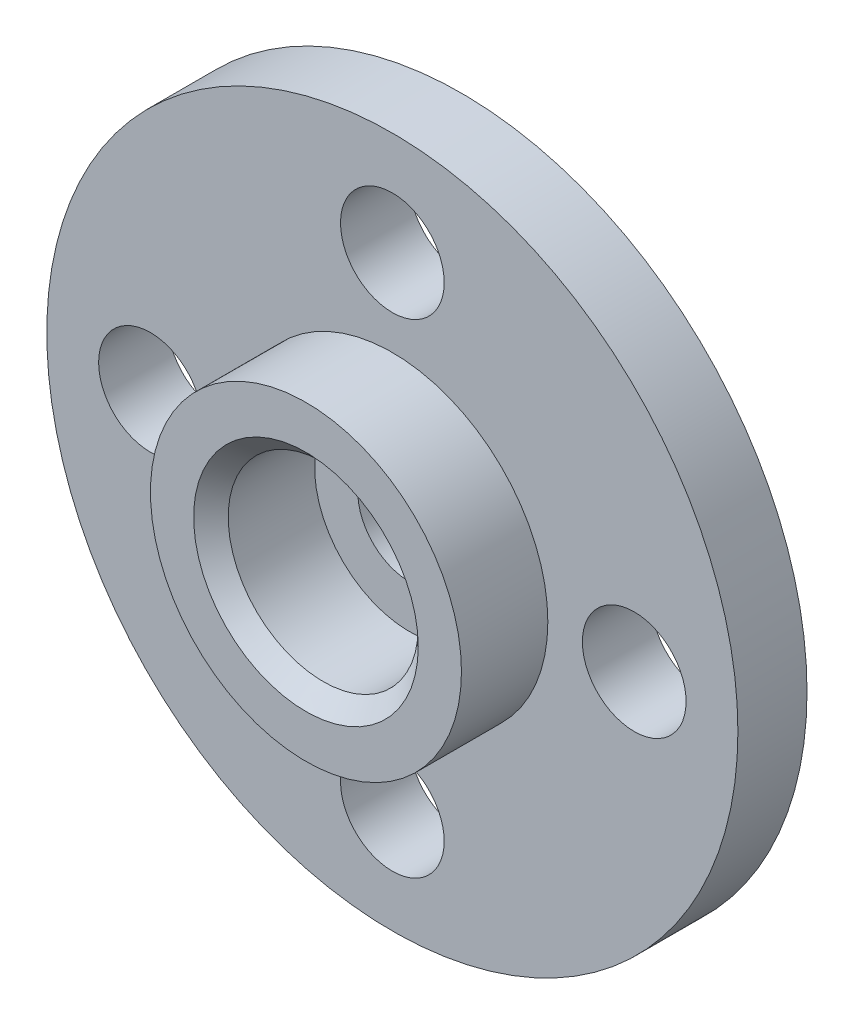
ISO-10303-21;
HEADER;
FILE_DESCRIPTION(('STEP AP214'),'2;1');
FILE_NAME('part.step','',(''),(''),'','','');
FILE_SCHEMA(('AUTOMOTIVE_DESIGN { 1 0 10303 214 1 1 1 1 }'));
ENDSEC;
DATA;
#1=APPLICATION_CONTEXT('core data for automotive mechanical design processes');
#2=APPLICATION_PROTOCOL_DEFINITION('international standard','automotive_design',2000,#1);
#3=PRODUCT_CONTEXT('',#1,'mechanical');
#4=PRODUCT('Part','Part','',(#3));
#5=PRODUCT_RELATED_PRODUCT_CATEGORY('part','',(#4));
#6=PRODUCT_DEFINITION_FORMATION('','',#4);
#7=PRODUCT_DEFINITION_CONTEXT('part definition',#1,'design');
#8=PRODUCT_DEFINITION('design','',#6,#7);
#9=PRODUCT_DEFINITION_SHAPE('','',#8);
#10=(LENGTH_UNIT() NAMED_UNIT(*) SI_UNIT(.MILLI.,.METRE.));
#11=(NAMED_UNIT(*) PLANE_ANGLE_UNIT() SI_UNIT($,.RADIAN.));
#12=(NAMED_UNIT(*) SI_UNIT($,.STERADIAN.) SOLID_ANGLE_UNIT());
#13=UNCERTAINTY_MEASURE_WITH_UNIT(LENGTH_MEASURE(1.E-05),#10,'distance_accuracy_value','');
#14=(GEOMETRIC_REPRESENTATION_CONTEXT(3) GLOBAL_UNCERTAINTY_ASSIGNED_CONTEXT((#13)) GLOBAL_UNIT_ASSIGNED_CONTEXT((#10,
#11,#12)) REPRESENTATION_CONTEXT('',''));
#15=CARTESIAN_POINT('',(0.,0.,0.));
#16=DIRECTION('',(0.,0.,1.));
#17=DIRECTION('',(1.,0.,0.));
#18=AXIS2_PLACEMENT_3D('',#15,#16,#17);
#19=CARTESIAN_POINT('',(0.,0.,0.));
#20=DIRECTION('',(0.,0.,1.));
#21=DIRECTION('',(1.,0.,0.));
#22=AXIS2_PLACEMENT_3D('',#19,#20,#21);
#23=CYLINDRICAL_SURFACE('',#22,1.5);
#24=CARTESIAN_POINT('',(0.,0.,0.));
#25=DIRECTION('',(0.,0.,1.));
#26=DIRECTION('',(1.,0.,0.));
#27=AXIS2_PLACEMENT_3D('',#24,#25,#26);
#28=CIRCLE('',#27,1.5);
#29=CARTESIAN_POINT('',(1.5,0.,0.));
#30=VERTEX_POINT('',#29);
#31=EDGE_CURVE('E54',#30,#30,#28,.T.);
#32=ORIENTED_EDGE('',*,*,#31,.F.);
#33=EDGE_LOOP('',(#32));
#34=FACE_BOUND('',#33,.T.);
#35=CARTESIAN_POINT('',(0.,0.,1.5));
#36=DIRECTION('',(0.,0.,1.));
#37=DIRECTION('',(1.,0.,0.));
#38=AXIS2_PLACEMENT_3D('',#35,#36,#37);
#39=CIRCLE('',#38,1.5);
#40=CARTESIAN_POINT('',(1.5,0.,1.5));
#41=VERTEX_POINT('',#40);
#42=EDGE_CURVE('E51',#41,#41,#39,.F.);
#43=ORIENTED_EDGE('',*,*,#42,.F.);
#44=EDGE_LOOP('',(#43));
#45=FACE_BOUND('',#44,.T.);
#46=ADVANCED_FACE('F33',(#34,#45),#23,.F.);
#47=CARTESIAN_POINT('',(0.,0.,2.));
#48=DIRECTION('',(0.,0.,-1.));
#49=DIRECTION('',(-1.,0.,0.));
#50=AXIS2_PLACEMENT_3D('',#47,#48,#49);
#51=CYLINDRICAL_SURFACE('',#50,10.);
#52=CARTESIAN_POINT('',(0.,0.,2.));
#53=DIRECTION('',(0.,0.,1.));
#54=DIRECTION('',(1.,0.,0.));
#55=AXIS2_PLACEMENT_3D('',#52,#53,#54);
#56=CIRCLE('',#55,10.);
#57=CARTESIAN_POINT('',(10.,0.,2.));
#58=VERTEX_POINT('',#57);
#59=EDGE_CURVE('E44',#58,#58,#56,.T.);
#60=ORIENTED_EDGE('',*,*,#59,.F.);
#61=EDGE_LOOP('',(#60));
#62=FACE_BOUND('',#61,.T.);
#63=CARTESIAN_POINT('',(0.,0.,0.));
#64=DIRECTION('',(0.,0.,1.));
#65=DIRECTION('',(1.,0.,0.));
#66=AXIS2_PLACEMENT_3D('',#63,#64,#65);
#67=CIRCLE('',#66,10.);
#68=CARTESIAN_POINT('',(10.,0.,0.));
#69=VERTEX_POINT('',#68);
#70=EDGE_CURVE('E48',#69,#69,#67,.T.);
#71=ORIENTED_EDGE('',*,*,#70,.T.);
#72=EDGE_LOOP('',(#71));
#73=FACE_BOUND('',#72,.T.);
#74=ADVANCED_FACE('F111',(#62,#73),#51,.T.);
#75=CARTESIAN_POINT('',(0.,0.,2.));
#76=DIRECTION('',(0.,0.,1.));
#77=DIRECTION('',(1.,0.,0.));
#78=AXIS2_PLACEMENT_3D('',#75,#76,#77);
#79=PLANE('',#78);
#80=CARTESIAN_POINT('',(0.,7.,2.));
#81=DIRECTION('',(0.,0.,1.));
#82=DIRECTION('',(1.,0.,0.));
#83=AXIS2_PLACEMENT_3D('',#80,#81,#82);
#84=CIRCLE('',#83,1.5);
#85=CARTESIAN_POINT('',(1.49999999999998,7.,2.));
#86=VERTEX_POINT('',#85);
#87=EDGE_CURVE('E74',#86,#86,#84,.T.);
#88=ORIENTED_EDGE('',*,*,#87,.F.);
#89=EDGE_LOOP('',(#88));
#90=FACE_BOUND('',#89,.T.);
#91=CARTESIAN_POINT('',(-7.,0.,2.));
#92=DIRECTION('',(0.,0.,1.));
#93=DIRECTION('',(1.,0.,0.));
#94=AXIS2_PLACEMENT_3D('',#91,#92,#93);
#95=CIRCLE('',#94,1.5);
#96=CARTESIAN_POINT('',(-5.5,0.,2.));
#97=VERTEX_POINT('',#96);
#98=EDGE_CURVE('E77',#97,#97,#95,.T.);
#99=ORIENTED_EDGE('',*,*,#98,.F.);
#100=EDGE_LOOP('',(#99));
#101=FACE_BOUND('',#100,.T.);
#102=CARTESIAN_POINT('',(0.,-7.,2.));
#103=DIRECTION('',(0.,0.,1.));
#104=DIRECTION('',(1.,0.,0.));
#105=AXIS2_PLACEMENT_3D('',#102,#103,#104);
#106=CIRCLE('',#105,1.5);
#107=CARTESIAN_POINT('',(1.50000000000007,-7.,2.));
#108=VERTEX_POINT('',#107);
#109=EDGE_CURVE('E80',#108,#108,#106,.T.);
#110=ORIENTED_EDGE('',*,*,#109,.F.);
#111=EDGE_LOOP('',(#110));
#112=FACE_BOUND('',#111,.T.);
#113=CARTESIAN_POINT('',(7.,0.,2.));
#114=DIRECTION('',(0.,0.,1.));
#115=DIRECTION('',(1.,0.,0.));
#116=AXIS2_PLACEMENT_3D('',#113,#114,#115);
#117=CIRCLE('',#116,1.5);
#118=CARTESIAN_POINT('',(8.5,0.,2.));
#119=VERTEX_POINT('',#118);
#120=EDGE_CURVE('E68',#119,#119,#117,.T.);
#121=ORIENTED_EDGE('',*,*,#120,.F.);
#122=EDGE_LOOP('',(#121));
#123=FACE_BOUND('',#122,.T.);
#124=CARTESIAN_POINT('',(0.,0.,2.));
#125=DIRECTION('',(0.,0.,1.));
#126=DIRECTION('',(1.,0.,0.));
#127=AXIS2_PLACEMENT_3D('',#124,#125,#126);
#128=CIRCLE('',#127,4.5);
#129=CARTESIAN_POINT('',(4.5,0.,2.));
#130=VERTEX_POINT('',#129);
#131=EDGE_CURVE('E59',#130,#130,#128,.T.);
#132=ORIENTED_EDGE('',*,*,#131,.F.);
#133=EDGE_LOOP('',(#132));
#134=FACE_BOUND('',#133,.T.);
#135=ORIENTED_EDGE('',*,*,#59,.T.);
#136=EDGE_LOOP('',(#135));
#137=FACE_BOUND('',#136,.T.);
#138=ADVANCED_FACE('F99',(#90,#101,#112,#123,#134,#137),#79,.T.);
#139=CARTESIAN_POINT('',(0.,0.,0.));
#140=DIRECTION('',(0.,0.,1.));
#141=DIRECTION('',(1.,0.,0.));
#142=AXIS2_PLACEMENT_3D('',#139,#140,#141);
#143=PLANE('',#142);
#144=CARTESIAN_POINT('',(0.,7.,0.));
#145=DIRECTION('',(0.,0.,-1.));
#146=DIRECTION('',(-1.,0.,0.));
#147=AXIS2_PLACEMENT_3D('',#144,#145,#146);
#148=CIRCLE('',#147,1.5);
#149=CARTESIAN_POINT('',(-1.50000000000002,7.,0.));
#150=VERTEX_POINT('',#149);
#151=EDGE_CURVE('E83',#150,#150,#148,.T.);
#152=ORIENTED_EDGE('',*,*,#151,.F.);
#153=EDGE_LOOP('',(#152));
#154=FACE_BOUND('',#153,.T.);
#155=CARTESIAN_POINT('',(-7.,0.,0.));
#156=DIRECTION('',(0.,0.,-1.));
#157=DIRECTION('',(-1.,0.,0.));
#158=AXIS2_PLACEMENT_3D('',#155,#156,#157);
#159=CIRCLE('',#158,1.5);
#160=CARTESIAN_POINT('',(-8.5,0.,0.));
#161=VERTEX_POINT('',#160);
#162=EDGE_CURVE('E87',#161,#161,#159,.T.);
#163=ORIENTED_EDGE('',*,*,#162,.F.);
#164=EDGE_LOOP('',(#163));
#165=FACE_BOUND('',#164,.T.);
#166=CARTESIAN_POINT('',(0.,-7.,0.));
#167=DIRECTION('',(0.,0.,-1.));
#168=DIRECTION('',(-1.,0.,0.));
#169=AXIS2_PLACEMENT_3D('',#166,#167,#168);
#170=CIRCLE('',#169,1.5);
#171=CARTESIAN_POINT('',(-1.49999999999993,-7.,0.));
#172=VERTEX_POINT('',#171);
#173=EDGE_CURVE('E84',#172,#172,#170,.T.);
#174=ORIENTED_EDGE('',*,*,#173,.F.);
#175=EDGE_LOOP('',(#174));
#176=FACE_BOUND('',#175,.T.);
#177=CARTESIAN_POINT('',(7.,0.,0.));
#178=DIRECTION('',(0.,0.,-1.));
#179=DIRECTION('',(-1.,0.,0.));
#180=AXIS2_PLACEMENT_3D('',#177,#178,#179);
#181=CIRCLE('',#180,1.5);
#182=CARTESIAN_POINT('',(5.5,0.,0.));
#183=VERTEX_POINT('',#182);
#184=EDGE_CURVE('E71',#183,#183,#181,.T.);
#185=ORIENTED_EDGE('',*,*,#184,.F.);
#186=EDGE_LOOP('',(#185));
#187=FACE_BOUND('',#186,.T.);
#188=ORIENTED_EDGE('',*,*,#31,.T.);
#189=EDGE_LOOP('',(#188));
#190=FACE_BOUND('',#189,.T.);
#191=ORIENTED_EDGE('',*,*,#70,.F.);
#192=EDGE_LOOP('',(#191));
#193=FACE_BOUND('',#192,.T.);
#194=ADVANCED_FACE('F95',(#154,#165,#176,#187,#190,#193),#143,.F.);
#195=CARTESIAN_POINT('',(0.,0.,4.5));
#196=DIRECTION('',(0.,0.,-1.));
#197=DIRECTION('',(-1.,0.,0.));
#198=AXIS2_PLACEMENT_3D('',#195,#196,#197);
#199=CYLINDRICAL_SURFACE('',#198,4.5);
#200=CARTESIAN_POINT('',(0.,0.,4.5));
#201=DIRECTION('',(0.,0.,1.));
#202=DIRECTION('',(1.,0.,0.));
#203=AXIS2_PLACEMENT_3D('',#200,#201,#202);
#204=CIRCLE('',#203,4.5);
#205=CARTESIAN_POINT('',(4.5,0.,4.5));
#206=VERTEX_POINT('',#205);
#207=EDGE_CURVE('E57',#206,#206,#204,.T.);
#208=ORIENTED_EDGE('',*,*,#207,.F.);
#209=EDGE_LOOP('',(#208));
#210=FACE_BOUND('',#209,.T.);
#211=ORIENTED_EDGE('',*,*,#131,.T.);
#212=EDGE_LOOP('',(#211));
#213=FACE_BOUND('',#212,.T.);
#214=ADVANCED_FACE('F98',(#210,#213),#199,.T.);
#215=CARTESIAN_POINT('',(0.,0.,4.5));
#216=DIRECTION('',(0.,0.,1.));
#217=DIRECTION('',(1.,0.,0.));
#218=AXIS2_PLACEMENT_3D('',#215,#216,#217);
#219=PLANE('',#218);
#220=CARTESIAN_POINT('',(0.,0.,4.5));
#221=DIRECTION('',(0.,0.,1.));
#222=DIRECTION('',(1.,0.,0.));
#223=AXIS2_PLACEMENT_3D('',#220,#221,#222);
#224=CIRCLE('',#223,3.25);
#225=CARTESIAN_POINT('',(3.25,0.,4.5));
#226=VERTEX_POINT('',#225);
#227=EDGE_CURVE('E10',#226,#226,#224,.F.);
#228=ORIENTED_EDGE('',*,*,#227,.T.);
#229=EDGE_LOOP('',(#228));
#230=FACE_BOUND('',#229,.T.);
#231=ORIENTED_EDGE('',*,*,#207,.T.);
#232=EDGE_LOOP('',(#231));
#233=FACE_BOUND('',#232,.T.);
#234=ADVANCED_FACE('F127',(#230,#233),#219,.T.);
#235=CARTESIAN_POINT('',(0.,0.,1.5));
#236=DIRECTION('',(0.,0.,1.));
#237=DIRECTION('',(1.,0.,0.));
#238=AXIS2_PLACEMENT_3D('',#235,#236,#237);
#239=PLANE('',#238);
#240=CARTESIAN_POINT('',(0.,0.,1.5));
#241=DIRECTION('',(0.,0.,1.));
#242=DIRECTION('',(1.,0.,0.));
#243=AXIS2_PLACEMENT_3D('',#240,#241,#242);
#244=CIRCLE('',#243,2.75);
#245=CARTESIAN_POINT('',(2.75,0.,1.5));
#246=VERTEX_POINT('',#245);
#247=EDGE_CURVE('E55',#246,#246,#244,.T.);
#248=ORIENTED_EDGE('',*,*,#247,.T.);
#249=EDGE_LOOP('',(#248));
#250=FACE_BOUND('',#249,.T.);
#251=ORIENTED_EDGE('',*,*,#42,.T.);
#252=EDGE_LOOP('',(#251));
#253=FACE_BOUND('',#252,.T.);
#254=ADVANCED_FACE('F130',(#250,#253),#239,.T.);
#255=CARTESIAN_POINT('',(0.,0.,1.5));
#256=DIRECTION('',(0.,0.,1.));
#257=DIRECTION('',(1.,0.,0.));
#258=AXIS2_PLACEMENT_3D('',#255,#256,#257);
#259=CYLINDRICAL_SURFACE('',#258,2.75);
#260=CARTESIAN_POINT('',(0.,0.,4.));
#261=DIRECTION('',(0.,0.,1.));
#262=DIRECTION('',(1.,0.,0.));
#263=AXIS2_PLACEMENT_3D('',#260,#261,#262);
#264=CIRCLE('',#263,2.75);
#265=CARTESIAN_POINT('',(2.75,0.,4.));
#266=VERTEX_POINT('',#265);
#267=EDGE_CURVE('E40',#266,#266,#264,.T.);
#268=ORIENTED_EDGE('',*,*,#267,.T.);
#269=EDGE_LOOP('',(#268));
#270=FACE_BOUND('',#269,.T.);
#271=ORIENTED_EDGE('',*,*,#247,.F.);
#272=EDGE_LOOP('',(#271));
#273=FACE_BOUND('',#272,.T.);
#274=ADVANCED_FACE('F132',(#270,#273),#259,.F.);
#275=CARTESIAN_POINT('',(0.,0.,4.));
#276=DIRECTION('',(0.,0.,1.));
#277=DIRECTION('',(1.,0.,0.));
#278=AXIS2_PLACEMENT_3D('',#275,#276,#277);
#279=CONICAL_SURFACE('',#278,2.75,0.785398163397449);
#280=ORIENTED_EDGE('',*,*,#227,.F.);
#281=EDGE_LOOP('',(#280));
#282=FACE_BOUND('',#281,.T.);
#283=ORIENTED_EDGE('',*,*,#267,.F.);
#284=EDGE_LOOP('',(#283));
#285=FACE_BOUND('',#284,.T.);
#286=ADVANCED_FACE('F35',(#282,#285),#279,.F.);
#287=CARTESIAN_POINT('',(7.,0.,4.5));
#288=DIRECTION('',(0.,0.,-1.));
#289=DIRECTION('',(-1.,0.,0.));
#290=AXIS2_PLACEMENT_3D('',#287,#288,#289);
#291=CYLINDRICAL_SURFACE('',#290,1.5);
#292=ORIENTED_EDGE('',*,*,#120,.T.);
#293=EDGE_LOOP('',(#292));
#294=FACE_BOUND('',#293,.T.);
#295=ORIENTED_EDGE('',*,*,#184,.T.);
#296=EDGE_LOOP('',(#295));
#297=FACE_BOUND('',#296,.T.);
#298=ADVANCED_FACE('F138',(#294,#297),#291,.F.);
#299=CARTESIAN_POINT('',(0.,-7.,4.5));
#300=DIRECTION('',(0.,0.,-1.));
#301=DIRECTION('',(-1.,0.,0.));
#302=AXIS2_PLACEMENT_3D('',#299,#300,#301);
#303=CYLINDRICAL_SURFACE('',#302,1.5);
#304=ORIENTED_EDGE('',*,*,#109,.T.);
#305=EDGE_LOOP('',(#304));
#306=FACE_BOUND('',#305,.T.);
#307=ORIENTED_EDGE('',*,*,#173,.T.);
#308=EDGE_LOOP('',(#307));
#309=FACE_BOUND('',#308,.T.);
#310=ADVANCED_FACE('F141',(#306,#309),#303,.F.);
#311=CARTESIAN_POINT('',(-7.,0.,4.5));
#312=DIRECTION('',(0.,0.,-1.));
#313=DIRECTION('',(-1.,0.,0.));
#314=AXIS2_PLACEMENT_3D('',#311,#312,#313);
#315=CYLINDRICAL_SURFACE('',#314,1.5);
#316=ORIENTED_EDGE('',*,*,#98,.T.);
#317=EDGE_LOOP('',(#316));
#318=FACE_BOUND('',#317,.T.);
#319=ORIENTED_EDGE('',*,*,#162,.T.);
#320=EDGE_LOOP('',(#319));
#321=FACE_BOUND('',#320,.T.);
#322=ADVANCED_FACE('F145',(#318,#321),#315,.F.);
#323=CARTESIAN_POINT('',(0.,7.,4.5));
#324=DIRECTION('',(0.,0.,-1.));
#325=DIRECTION('',(-1.,0.,0.));
#326=AXIS2_PLACEMENT_3D('',#323,#324,#325);
#327=CYLINDRICAL_SURFACE('',#326,1.5);
#328=ORIENTED_EDGE('',*,*,#87,.T.);
#329=EDGE_LOOP('',(#328));
#330=FACE_BOUND('',#329,.T.);
#331=ORIENTED_EDGE('',*,*,#151,.T.);
#332=EDGE_LOOP('',(#331));
#333=FACE_BOUND('',#332,.T.);
#334=ADVANCED_FACE('F93',(#330,#333),#327,.F.);
#335=CLOSED_SHELL('',(#46,#74,#138,#194,#214,#234,#254,#274,#286,#298,#310,#322,#334));
#336=MANIFOLD_SOLID_BREP('B2',#335);
#337=ADVANCED_BREP_SHAPE_REPRESENTATION('',(#18,#336),#14);
#338=SHAPE_DEFINITION_REPRESENTATION(#9,#337);
ENDSEC;
END-ISO-10303-21;
